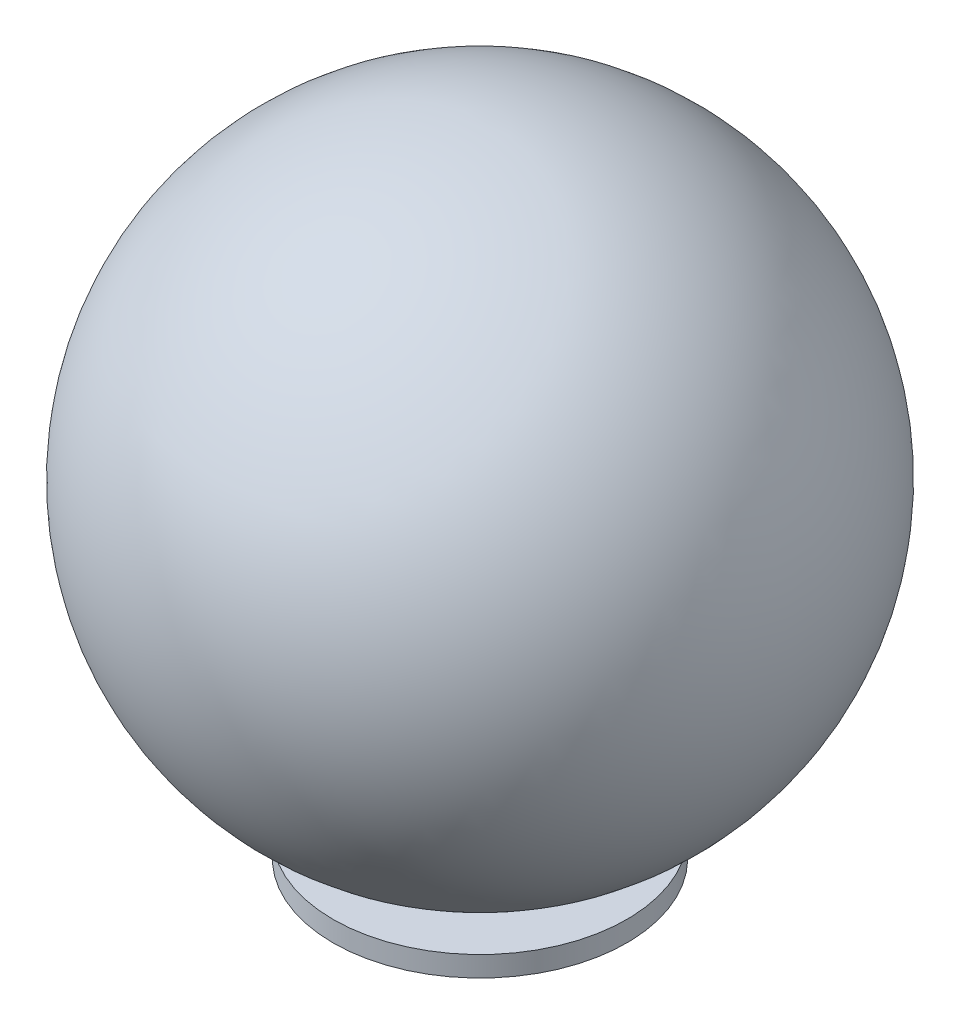
ISO-10303-21;
HEADER;
FILE_DESCRIPTION(('STEP AP214'),'2;1');
FILE_NAME('part.step','',(''),(''),'','','');
FILE_SCHEMA(('AUTOMOTIVE_DESIGN { 1 0 10303 214 1 1 1 1 }'));
ENDSEC;
DATA;
#1=APPLICATION_CONTEXT('core data for automotive mechanical design processes');
#2=APPLICATION_PROTOCOL_DEFINITION('international standard','automotive_design',2000,#1);
#3=PRODUCT_CONTEXT('',#1,'mechanical');
#4=PRODUCT('Part','Part','',(#3));
#5=PRODUCT_RELATED_PRODUCT_CATEGORY('part','',(#4));
#6=PRODUCT_DEFINITION_FORMATION('','',#4);
#7=PRODUCT_DEFINITION_CONTEXT('part definition',#1,'design');
#8=PRODUCT_DEFINITION('design','',#6,#7);
#9=PRODUCT_DEFINITION_SHAPE('','',#8);
#10=(LENGTH_UNIT() NAMED_UNIT(*) SI_UNIT(.MILLI.,.METRE.));
#11=(NAMED_UNIT(*) PLANE_ANGLE_UNIT() SI_UNIT($,.RADIAN.));
#12=(NAMED_UNIT(*) SI_UNIT($,.STERADIAN.) SOLID_ANGLE_UNIT());
#13=UNCERTAINTY_MEASURE_WITH_UNIT(LENGTH_MEASURE(1.E-05),#10,'distance_accuracy_value','');
#14=(GEOMETRIC_REPRESENTATION_CONTEXT(3) GLOBAL_UNCERTAINTY_ASSIGNED_CONTEXT((#13)) GLOBAL_UNIT_ASSIGNED_CONTEXT((#10,
#11,#12)) REPRESENTATION_CONTEXT('',''));
#15=CARTESIAN_POINT('',(0.,0.,0.));
#16=DIRECTION('',(0.,0.,1.));
#17=DIRECTION('',(1.,0.,0.));
#18=AXIS2_PLACEMENT_3D('',#15,#16,#17);
#19=CARTESIAN_POINT('',(0.,-161.,0.));
#20=DIRECTION('',(0.,1.,0.));
#21=DIRECTION('',(0.,0.,1.));
#22=AXIS2_PLACEMENT_3D('',#19,#20,#21);
#23=CYLINDRICAL_SURFACE('',#22,72.0864066489201);
#24=CARTESIAN_POINT('',(0.,-161.,0.));
#25=DIRECTION('',(0.,1.,0.));
#26=DIRECTION('',(0.,0.,1.));
#27=AXIS2_PLACEMENT_3D('',#24,#25,#26);
#28=CIRCLE('',#27,72.0864066489201);
#29=CARTESIAN_POINT('',(0.,-161.,72.0864066489201));
#30=VERTEX_POINT('',#29);
#31=EDGE_CURVE('E11',#30,#30,#28,.T.);
#32=ORIENTED_EDGE('',*,*,#31,.T.);
#33=EDGE_LOOP('',(#32));
#34=FACE_BOUND('',#33,.T.);
#35=CARTESIAN_POINT('',(0.,-151.,0.));
#36=DIRECTION('',(0.,1.,0.));
#37=DIRECTION('',(0.,0.,1.));
#38=AXIS2_PLACEMENT_3D('',#35,#36,#37);
#39=CIRCLE('',#38,72.0864066489201);
#40=CARTESIAN_POINT('',(0.,-151.,72.0864066489201));
#41=VERTEX_POINT('',#40);
#42=EDGE_CURVE('E44',#41,#41,#39,.T.);
#43=ORIENTED_EDGE('',*,*,#42,.F.);
#44=EDGE_LOOP('',(#43));
#45=FACE_BOUND('',#44,.T.);
#46=ADVANCED_FACE('F41',(#34,#45),#23,.T.);
#47=CARTESIAN_POINT('',(0.,-161.,0.));
#48=DIRECTION('',(0.,1.,0.));
#49=DIRECTION('',(0.,0.,1.));
#50=AXIS2_PLACEMENT_3D('',#47,#48,#49);
#51=PLANE('',#50);
#52=ORIENTED_EDGE('',*,*,#31,.F.);
#53=EDGE_LOOP('',(#52));
#54=FACE_BOUND('',#53,.T.);
#55=ADVANCED_FACE('F56',(#54),#51,.F.);
#56=CARTESIAN_POINT('',(0.,-151.,0.));
#57=DIRECTION('',(0.,1.,0.));
#58=DIRECTION('',(0.,0.,1.));
#59=AXIS2_PLACEMENT_3D('',#56,#57,#58);
#60=PLANE('',#59);
#61=ORIENTED_EDGE('',*,*,#42,.T.);
#62=EDGE_LOOP('',(#61));
#63=FACE_BOUND('',#62,.T.);
#64=ADVANCED_FACE('F53',(#63),#60,.T.);
#65=CLOSED_SHELL('',(#46,#55,#64));
#66=MANIFOLD_SOLID_BREP('B2',#65);
#67=CARTESIAN_POINT('',(0.,0.,0.));
#68=DIRECTION('',(0.,1.,0.));
#69=DIRECTION('',(1.,0.,0.));
#70=AXIS2_PLACEMENT_3D('',#67,#68,#69);
#71=SPHERICAL_SURFACE('',#70,150.456780159248);
#72=CARTESIAN_POINT('',(0.,150.456780159248,0.));
#73=VERTEX_POINT('',#72);
#74=VERTEX_LOOP('',#73);
#75=FACE_BOUND('',#74,.T.);
#76=ADVANCED_FACE('F83',(#75),#71,.T.);
#77=CLOSED_SHELL('',(#76));
#78=CARTESIAN_POINT('',(0.,0.,0.));
#79=DIRECTION('',(0.,1.,0.));
#80=DIRECTION('',(-1.,0.,0.));
#81=AXIS2_PLACEMENT_3D('',#78,#79,#80);
#82=SPHERICAL_SURFACE('',#81,144.67820867112);
#83=CARTESIAN_POINT('',(0.,144.67820867112,0.));
#84=VERTEX_POINT('',#83);
#85=VERTEX_LOOP('',#84);
#86=FACE_BOUND('',#85,.T.);
#87=ADVANCED_FACE('F96',(#86),#82,.F.);
#88=CLOSED_SHELL('',(#87));
#89=ORIENTED_CLOSED_SHELL('',*,#88,.T.);
#90=BREP_WITH_VOIDS('B6',#77,(#89));
#91=ADVANCED_BREP_SHAPE_REPRESENTATION('',(#18,#66,#90),#14);
#92=SHAPE_DEFINITION_REPRESENTATION(#9,#91);
ENDSEC;
END-ISO-10303-21;
